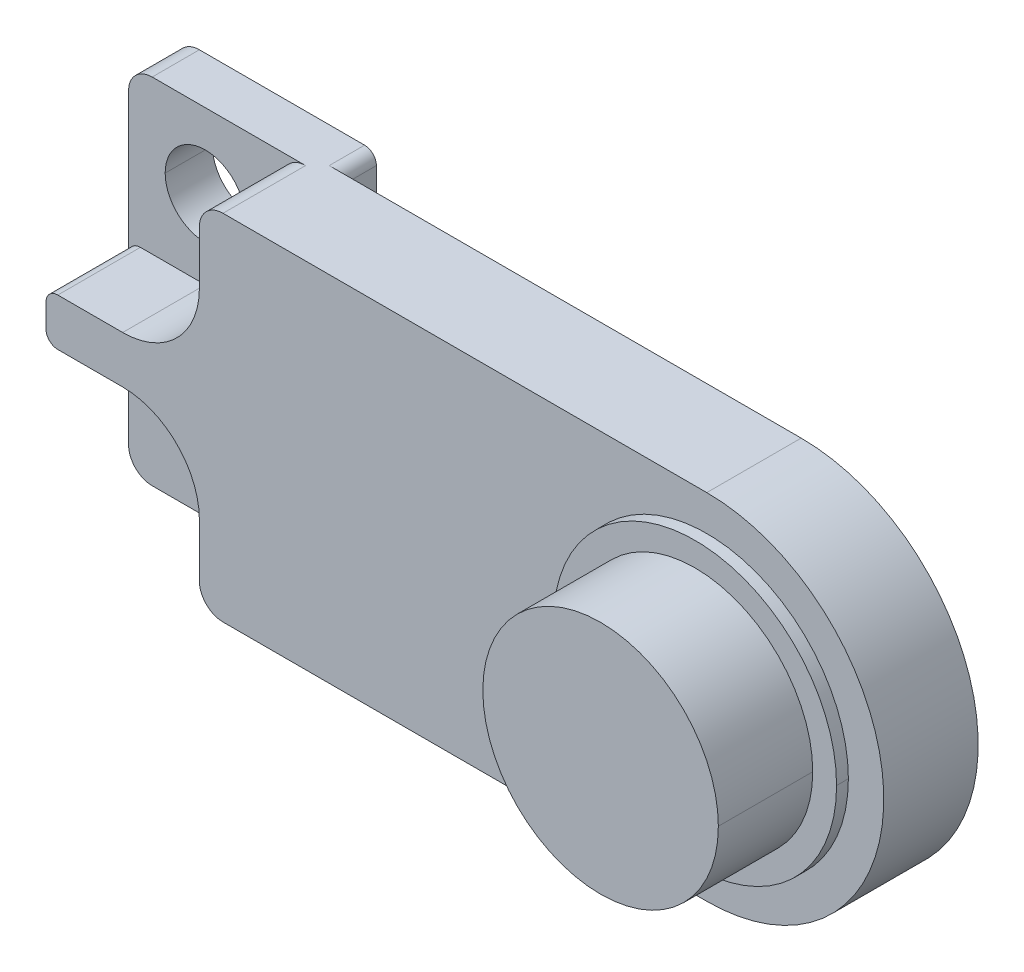
ISO-10303-21;
HEADER;
FILE_DESCRIPTION(('STEP AP214'),'2;1');
FILE_NAME('part.step','',(''),(''),'','','');
FILE_SCHEMA(('AUTOMOTIVE_DESIGN { 1 0 10303 214 1 1 1 1 }'));
ENDSEC;
DATA;
#1=APPLICATION_CONTEXT('core data for automotive mechanical design processes');
#2=APPLICATION_PROTOCOL_DEFINITION('international standard','automotive_design',2000,#1);
#3=PRODUCT_CONTEXT('',#1,'mechanical');
#4=PRODUCT('Part','Part','',(#3));
#5=PRODUCT_RELATED_PRODUCT_CATEGORY('part','',(#4));
#6=PRODUCT_DEFINITION_FORMATION('','',#4);
#7=PRODUCT_DEFINITION_CONTEXT('part definition',#1,'design');
#8=PRODUCT_DEFINITION('design','',#6,#7);
#9=PRODUCT_DEFINITION_SHAPE('','',#8);
#10=(LENGTH_UNIT() NAMED_UNIT(*) SI_UNIT(.MILLI.,.METRE.));
#11=(NAMED_UNIT(*) PLANE_ANGLE_UNIT() SI_UNIT($,.RADIAN.));
#12=(NAMED_UNIT(*) SI_UNIT($,.STERADIAN.) SOLID_ANGLE_UNIT());
#13=UNCERTAINTY_MEASURE_WITH_UNIT(LENGTH_MEASURE(1.E-05),#10,'distance_accuracy_value','');
#14=(GEOMETRIC_REPRESENTATION_CONTEXT(3) GLOBAL_UNCERTAINTY_ASSIGNED_CONTEXT((#13)) GLOBAL_UNIT_ASSIGNED_CONTEXT((#10,
#11,#12)) REPRESENTATION_CONTEXT('',''));
#15=CARTESIAN_POINT('',(0.,0.,0.));
#16=DIRECTION('',(0.,0.,1.));
#17=DIRECTION('',(1.,0.,0.));
#18=AXIS2_PLACEMENT_3D('',#15,#16,#17);
#19=CARTESIAN_POINT('',(19.5,-1.83387272193696,10.));
#20=DIRECTION('',(0.,0.,1.));
#21=DIRECTION('',(1.,0.,0.));
#22=AXIS2_PLACEMENT_3D('',#19,#20,#21);
#23=PLANE('',#22);
#24=CARTESIAN_POINT('',(19.5,-1.83387272193696,10.));
#25=DIRECTION('',(0.,0.,1.));
#26=DIRECTION('',(1.,0.,0.));
#27=AXIS2_PLACEMENT_3D('',#24,#25,#26);
#28=CIRCLE('',#27,4.99);
#29=CARTESIAN_POINT('',(24.49,-1.83387272193696,10.));
#30=VERTEX_POINT('',#29);
#31=CARTESIAN_POINT('',(14.51,-1.83387272193696,10.));
#32=VERTEX_POINT('',#31);
#33=EDGE_CURVE('E299',#30,#32,#28,.T.);
#34=ORIENTED_EDGE('',*,*,#33,.T.);
#35=CARTESIAN_POINT('',(19.5,-1.83387272193696,10.));
#36=DIRECTION('',(0.,0.,1.));
#37=DIRECTION('',(1.,0.,0.));
#38=AXIS2_PLACEMENT_3D('',#35,#36,#37);
#39=CIRCLE('',#38,4.99);
#40=EDGE_CURVE('E9',#32,#30,#39,.T.);
#41=ORIENTED_EDGE('',*,*,#40,.T.);
#42=EDGE_LOOP('',(#34,#41));
#43=FACE_BOUND('',#42,.T.);
#44=ADVANCED_FACE('F15',(#43),#23,.T.);
#45=CARTESIAN_POINT('',(19.5,-1.83387272193696,-8.14213562373094));
#46=DIRECTION('',(0.,0.,1.));
#47=DIRECTION('',(1.,0.,0.));
#48=AXIS2_PLACEMENT_3D('',#45,#46,#47);
#49=CYLINDRICAL_SURFACE('',#48,4.99);
#50=DIRECTION('',(0.,0.,1.));
#51=VECTOR('',#50,1.);
#52=CARTESIAN_POINT('',(14.51,-1.83387272193696,-8.14213562373094));
#53=LINE('',#52,#51);
#54=CARTESIAN_POINT('',(14.51,-1.83387272193696,6.));
#55=VERTEX_POINT('',#54);
#56=EDGE_CURVE('E293',#55,#32,#53,.T.);
#57=ORIENTED_EDGE('',*,*,#56,.F.);
#58=CARTESIAN_POINT('',(19.5,-1.83387272193696,6.));
#59=DIRECTION('',(0.,0.,-1.));
#60=DIRECTION('',(1.,0.,0.));
#61=AXIS2_PLACEMENT_3D('',#58,#59,#60);
#62=CIRCLE('',#61,4.99);
#63=CARTESIAN_POINT('',(24.49,-1.83387272193696,6.));
#64=VERTEX_POINT('',#63);
#65=EDGE_CURVE('E279',#64,#55,#62,.T.);
#66=ORIENTED_EDGE('',*,*,#65,.F.);
#67=DIRECTION('',(0.,0.,1.));
#68=VECTOR('',#67,1.);
#69=CARTESIAN_POINT('',(24.49,-1.83387272193696,-8.14213562373094));
#70=LINE('',#69,#68);
#71=EDGE_CURVE('E302',#64,#30,#70,.T.);
#72=ORIENTED_EDGE('',*,*,#71,.T.);
#73=ORIENTED_EDGE('',*,*,#40,.F.);
#74=EDGE_LOOP('',(#57,#66,#72,#73));
#75=FACE_BOUND('',#74,.T.);
#76=ADVANCED_FACE('F294',(#75),#49,.T.);
#77=CARTESIAN_POINT('',(-1.,-8.33387272193696,2.));
#78=DIRECTION('',(0.,0.,1.));
#79=DIRECTION('',(1.,0.,0.));
#80=AXIS2_PLACEMENT_3D('',#77,#78,#79);
#81=CYLINDRICAL_SURFACE('',#80,1.);
#82=CARTESIAN_POINT('',(-1.,-8.33387272193696,2.));
#83=DIRECTION('',(0.,0.,-1.));
#84=DIRECTION('',(1.,0.,0.));
#85=AXIS2_PLACEMENT_3D('',#82,#83,#84);
#86=CIRCLE('',#85,1.);
#87=CARTESIAN_POINT('',(-1.,-9.33387272193696,2.));
#88=VERTEX_POINT('',#87);
#89=CARTESIAN_POINT('',(-2.,-8.33387272193696,2.));
#90=VERTEX_POINT('',#89);
#91=EDGE_CURVE('E591',#88,#90,#86,.T.);
#92=ORIENTED_EDGE('',*,*,#91,.F.);
#93=DIRECTION('',(0.,0.,-1.));
#94=VECTOR('',#93,1.);
#95=CARTESIAN_POINT('',(-1.,-9.33387272193696,1.5));
#96=LINE('',#95,#94);
#97=CARTESIAN_POINT('',(-1.,-9.33387272193696,5.5));
#98=VERTEX_POINT('',#97);
#99=EDGE_CURVE('E526',#98,#88,#96,.T.);
#100=ORIENTED_EDGE('',*,*,#99,.F.);
#101=CARTESIAN_POINT('',(-1.,-8.33387272193696,5.5));
#102=DIRECTION('',(0.,0.,1.));
#103=DIRECTION('',(1.,0.,0.));
#104=AXIS2_PLACEMENT_3D('',#101,#102,#103);
#105=CIRCLE('',#104,1.);
#106=CARTESIAN_POINT('',(-2.,-8.33387272193696,5.5));
#107=VERTEX_POINT('',#106);
#108=EDGE_CURVE('E334',#107,#98,#105,.T.);
#109=ORIENTED_EDGE('',*,*,#108,.F.);
#110=DIRECTION('',(0.,0.,1.));
#111=VECTOR('',#110,1.);
#112=CARTESIAN_POINT('',(-2.,-8.33387272193696,2.));
#113=LINE('',#112,#111);
#114=EDGE_CURVE('E497',#90,#107,#113,.T.);
#115=ORIENTED_EDGE('',*,*,#114,.F.);
#116=EDGE_LOOP('',(#92,#100,#109,#115));
#117=FACE_BOUND('',#116,.T.);
#118=ADVANCED_FACE('F17',(#117),#81,.T.);
#119=CARTESIAN_POINT('',(-1.,4.66612727806304,1.5));
#120=DIRECTION('',(0.,0.,1.));
#121=DIRECTION('',(1.,0.,0.));
#122=AXIS2_PLACEMENT_3D('',#119,#120,#121);
#123=CYLINDRICAL_SURFACE('',#122,1.);
#124=CARTESIAN_POINT('',(-1.,4.66612727806304,2.));
#125=DIRECTION('',(0.,0.,-1.));
#126=DIRECTION('',(1.,0.,0.));
#127=AXIS2_PLACEMENT_3D('',#124,#125,#126);
#128=CIRCLE('',#127,1.);
#129=CARTESIAN_POINT('',(-2.,4.66612727806304,2.));
#130=VERTEX_POINT('',#129);
#131=CARTESIAN_POINT('',(-1.,5.66612727806305,2.));
#132=VERTEX_POINT('',#131);
#133=EDGE_CURVE('E24',#130,#132,#128,.T.);
#134=ORIENTED_EDGE('',*,*,#133,.F.);
#135=DIRECTION('',(0.,0.,-1.));
#136=VECTOR('',#135,1.);
#137=CARTESIAN_POINT('',(-2.,4.66612727806304,2.));
#138=LINE('',#137,#136);
#139=CARTESIAN_POINT('',(-2.,4.66612727806304,5.5));
#140=VERTEX_POINT('',#139);
#141=EDGE_CURVE('E601',#140,#130,#138,.T.);
#142=ORIENTED_EDGE('',*,*,#141,.F.);
#143=CARTESIAN_POINT('',(-1.,4.66612727806304,5.5));
#144=DIRECTION('',(0.,0.,1.));
#145=DIRECTION('',(1.,0.,0.));
#146=AXIS2_PLACEMENT_3D('',#143,#144,#145);
#147=CIRCLE('',#146,1.);
#148=CARTESIAN_POINT('',(-1.,5.66612727806304,5.5));
#149=VERTEX_POINT('',#148);
#150=EDGE_CURVE('E409',#149,#140,#147,.T.);
#151=ORIENTED_EDGE('',*,*,#150,.F.);
#152=DIRECTION('',(0.,0.,1.));
#153=VECTOR('',#152,1.);
#154=CARTESIAN_POINT('',(-1.,5.66612727806304,1.5));
#155=LINE('',#154,#153);
#156=EDGE_CURVE('E433',#132,#149,#155,.T.);
#157=ORIENTED_EDGE('',*,*,#156,.F.);
#158=EDGE_LOOP('',(#134,#142,#151,#157));
#159=FACE_BOUND('',#158,.T.);
#160=ADVANCED_FACE('F637',(#159),#123,.T.);
#161=CARTESIAN_POINT('',(-7.5,4.66612727806304,1.5));
#162=DIRECTION('',(0.,0.,-1.));
#163=DIRECTION('',(-1.,0.,0.));
#164=AXIS2_PLACEMENT_3D('',#161,#162,#163);
#165=CYLINDRICAL_SURFACE('',#164,1.);
#166=CARTESIAN_POINT('',(-7.5,4.66612727806304,2.));
#167=DIRECTION('',(0.,0.,1.));
#168=DIRECTION('',(1.,0.,0.));
#169=AXIS2_PLACEMENT_3D('',#166,#167,#168);
#170=CIRCLE('',#169,1.);
#171=CARTESIAN_POINT('',(-7.5,5.66612727806304,2.));
#172=VERTEX_POINT('',#171);
#173=CARTESIAN_POINT('',(-8.5,4.66612727806304,2.));
#174=VERTEX_POINT('',#173);
#175=EDGE_CURVE('E333',#172,#174,#170,.T.);
#176=ORIENTED_EDGE('',*,*,#175,.F.);
#177=DIRECTION('',(0.,0.,1.));
#178=VECTOR('',#177,1.);
#179=CARTESIAN_POINT('',(-7.5,5.66612727806304,1.5));
#180=LINE('',#179,#178);
#181=CARTESIAN_POINT('',(-7.5,5.66612727806304,0.));
#182=VERTEX_POINT('',#181);
#183=EDGE_CURVE('E353',#182,#172,#180,.T.);
#184=ORIENTED_EDGE('',*,*,#183,.F.);
#185=CARTESIAN_POINT('',(-7.5,4.66612727806304,0.));
#186=DIRECTION('',(0.,0.,-1.));
#187=DIRECTION('',(-1.,0.,0.));
#188=AXIS2_PLACEMENT_3D('',#185,#186,#187);
#189=CIRCLE('',#188,1.);
#190=CARTESIAN_POINT('',(-8.5,4.66612727806303,0.));
#191=VERTEX_POINT('',#190);
#192=EDGE_CURVE('E392',#191,#182,#189,.T.);
#193=ORIENTED_EDGE('',*,*,#192,.F.);
#194=DIRECTION('',(0.,0.,-1.));
#195=VECTOR('',#194,1.);
#196=CARTESIAN_POINT('',(-8.5,4.66612727806304,1.5));
#197=LINE('',#196,#195);
#198=EDGE_CURVE('E480',#174,#191,#197,.T.);
#199=ORIENTED_EDGE('',*,*,#198,.F.);
#200=EDGE_LOOP('',(#176,#184,#193,#199));
#201=FACE_BOUND('',#200,.T.);
#202=ADVANCED_FACE('F615',(#201),#165,.T.);
#203=CARTESIAN_POINT('',(-7.5,-8.33387272193696,1.5));
#204=DIRECTION('',(0.,0.,-1.));
#205=DIRECTION('',(-1.,0.,0.));
#206=AXIS2_PLACEMENT_3D('',#203,#204,#205);
#207=CYLINDRICAL_SURFACE('',#206,1.);
#208=CARTESIAN_POINT('',(-7.5,-8.33387272193696,2.));
#209=DIRECTION('',(0.,0.,1.));
#210=DIRECTION('',(1.,0.,0.));
#211=AXIS2_PLACEMENT_3D('',#208,#209,#210);
#212=CIRCLE('',#211,1.);
#213=CARTESIAN_POINT('',(-8.5,-8.33387272193696,2.));
#214=VERTEX_POINT('',#213);
#215=CARTESIAN_POINT('',(-7.5,-9.33387272193696,2.));
#216=VERTEX_POINT('',#215);
#217=EDGE_CURVE('E554',#214,#216,#212,.T.);
#218=ORIENTED_EDGE('',*,*,#217,.F.);
#219=DIRECTION('',(0.,0.,1.));
#220=VECTOR('',#219,1.);
#221=CARTESIAN_POINT('',(-8.5,-8.33387272193696,1.5));
#222=LINE('',#221,#220);
#223=CARTESIAN_POINT('',(-8.5,-8.33387272193696,0.));
#224=VERTEX_POINT('',#223);
#225=EDGE_CURVE('E366',#224,#214,#222,.T.);
#226=ORIENTED_EDGE('',*,*,#225,.F.);
#227=CARTESIAN_POINT('',(-7.5,-8.33387272193696,0.));
#228=DIRECTION('',(0.,0.,-1.));
#229=DIRECTION('',(-1.,0.,0.));
#230=AXIS2_PLACEMENT_3D('',#227,#228,#229);
#231=CIRCLE('',#230,1.);
#232=CARTESIAN_POINT('',(-7.5,-9.33387272193696,0.));
#233=VERTEX_POINT('',#232);
#234=EDGE_CURVE('E448',#233,#224,#231,.T.);
#235=ORIENTED_EDGE('',*,*,#234,.F.);
#236=DIRECTION('',(0.,0.,-1.));
#237=VECTOR('',#236,1.);
#238=CARTESIAN_POINT('',(-7.5,-9.33387272193696,1.5));
#239=LINE('',#238,#237);
#240=EDGE_CURVE('E479',#216,#233,#239,.T.);
#241=ORIENTED_EDGE('',*,*,#240,.F.);
#242=EDGE_LOOP('',(#218,#226,#235,#241));
#243=FACE_BOUND('',#242,.T.);
#244=ADVANCED_FACE('F653',(#243),#207,.T.);
#245=CARTESIAN_POINT('',(-0.5,-8.83387272193696,1.5));
#246=DIRECTION('',(0.,0.,-1.));
#247=DIRECTION('',(-1.,0.,0.));
#248=AXIS2_PLACEMENT_3D('',#245,#246,#247);
#249=CYLINDRICAL_SURFACE('',#248,0.5);
#250=CARTESIAN_POINT('',(-0.5,-8.83387272193696,1.5));
#251=DIRECTION('',(0.,0.,1.));
#252=DIRECTION('',(1.,0.,0.));
#253=AXIS2_PLACEMENT_3D('',#250,#251,#252);
#254=CIRCLE('',#253,0.5);
#255=CARTESIAN_POINT('',(-0.5,-9.33387272193696,1.5));
#256=VERTEX_POINT('',#255);
#257=CARTESIAN_POINT('',(0.,-8.83387272193696,1.5));
#258=VERTEX_POINT('',#257);
#259=EDGE_CURVE('E312',#256,#258,#254,.T.);
#260=ORIENTED_EDGE('',*,*,#259,.F.);
#261=DIRECTION('',(0.,0.,1.));
#262=VECTOR('',#261,1.);
#263=CARTESIAN_POINT('',(-0.5,-9.33387272193696,1.5));
#264=LINE('',#263,#262);
#265=CARTESIAN_POINT('',(-0.5,-9.33387272193696,0.));
#266=VERTEX_POINT('',#265);
#267=EDGE_CURVE('E511',#266,#256,#264,.T.);
#268=ORIENTED_EDGE('',*,*,#267,.F.);
#269=CARTESIAN_POINT('',(-0.5,-8.83387272193696,0.));
#270=DIRECTION('',(0.,0.,-1.));
#271=DIRECTION('',(-1.,0.,0.));
#272=AXIS2_PLACEMENT_3D('',#269,#270,#271);
#273=CIRCLE('',#272,0.5);
#274=CARTESIAN_POINT('',(0.,-8.83387272193696,0.));
#275=VERTEX_POINT('',#274);
#276=EDGE_CURVE('E362',#275,#266,#273,.T.);
#277=ORIENTED_EDGE('',*,*,#276,.F.);
#278=DIRECTION('',(0.,0.,-1.));
#279=VECTOR('',#278,1.);
#280=CARTESIAN_POINT('',(0.,-8.83387272193696,1.5));
#281=LINE('',#280,#279);
#282=EDGE_CURVE('E358',#258,#275,#281,.T.);
#283=ORIENTED_EDGE('',*,*,#282,.F.);
#284=EDGE_LOOP('',(#260,#268,#277,#283));
#285=FACE_BOUND('',#284,.T.);
#286=ADVANCED_FACE('F697',(#285),#249,.T.);
#287=CARTESIAN_POINT('',(-0.5,5.16612727806304,1.5));
#288=DIRECTION('',(0.,0.,-1.));
#289=DIRECTION('',(-1.,0.,0.));
#290=AXIS2_PLACEMENT_3D('',#287,#288,#289);
#291=CYLINDRICAL_SURFACE('',#290,0.5);
#292=CARTESIAN_POINT('',(-0.5,5.16612727806304,1.5));
#293=DIRECTION('',(0.,0.,1.));
#294=DIRECTION('',(1.,0.,0.));
#295=AXIS2_PLACEMENT_3D('',#292,#293,#294);
#296=CIRCLE('',#295,0.5);
#297=CARTESIAN_POINT('',(0.,5.16612727806304,1.5));
#298=VERTEX_POINT('',#297);
#299=CARTESIAN_POINT('',(-0.5,5.66612727806304,1.5));
#300=VERTEX_POINT('',#299);
#301=EDGE_CURVE('E315',#298,#300,#296,.T.);
#302=ORIENTED_EDGE('',*,*,#301,.F.);
#303=DIRECTION('',(0.,0.,1.));
#304=VECTOR('',#303,1.);
#305=CARTESIAN_POINT('',(0.,5.16612727806304,1.5));
#306=LINE('',#305,#304);
#307=CARTESIAN_POINT('',(0.,5.16612727806304,0.));
#308=VERTEX_POINT('',#307);
#309=EDGE_CURVE('E530',#308,#298,#306,.T.);
#310=ORIENTED_EDGE('',*,*,#309,.F.);
#311=CARTESIAN_POINT('',(-0.5,5.16612727806304,0.));
#312=DIRECTION('',(0.,0.,-1.));
#313=DIRECTION('',(-1.,0.,0.));
#314=AXIS2_PLACEMENT_3D('',#311,#312,#313);
#315=CIRCLE('',#314,0.5);
#316=CARTESIAN_POINT('',(-0.5,5.66612727806304,0.));
#317=VERTEX_POINT('',#316);
#318=EDGE_CURVE('E381',#317,#308,#315,.T.);
#319=ORIENTED_EDGE('',*,*,#318,.F.);
#320=DIRECTION('',(0.,0.,-1.));
#321=VECTOR('',#320,1.);
#322=CARTESIAN_POINT('',(-0.5,5.66612727806304,1.5));
#323=LINE('',#322,#321);
#324=EDGE_CURVE('E316',#300,#317,#323,.T.);
#325=ORIENTED_EDGE('',*,*,#324,.F.);
#326=EDGE_LOOP('',(#302,#310,#319,#325));
#327=FACE_BOUND('',#326,.T.);
#328=ADVANCED_FACE('F690',(#327),#291,.T.);
#329=CARTESIAN_POINT('',(-8.,-1.33387272193696,2.));
#330=DIRECTION('',(0.,0.,1.));
#331=DIRECTION('',(1.,0.,0.));
#332=AXIS2_PLACEMENT_3D('',#329,#330,#331);
#333=CYLINDRICAL_SURFACE('',#332,0.5);
#334=CARTESIAN_POINT('',(-8.,-1.33387272193696,2.));
#335=DIRECTION('',(0.,0.,-1.));
#336=DIRECTION('',(1.,0.,0.));
#337=AXIS2_PLACEMENT_3D('',#334,#335,#336);
#338=CIRCLE('',#337,0.5);
#339=CARTESIAN_POINT('',(-8.5,-1.33387272193696,2.));
#340=VERTEX_POINT('',#339);
#341=CARTESIAN_POINT('',(-8.,-0.833872721936961,2.));
#342=VERTEX_POINT('',#341);
#343=EDGE_CURVE('E47',#340,#342,#338,.T.);
#344=ORIENTED_EDGE('',*,*,#343,.F.);
#345=DIRECTION('',(0.,0.,-1.));
#346=VECTOR('',#345,1.);
#347=CARTESIAN_POINT('',(-8.5,-1.33387272193696,1.5));
#348=LINE('',#347,#346);
#349=CARTESIAN_POINT('',(-8.5,-1.33387272193696,5.5));
#350=VERTEX_POINT('',#349);
#351=EDGE_CURVE('E492',#350,#340,#348,.T.);
#352=ORIENTED_EDGE('',*,*,#351,.F.);
#353=CARTESIAN_POINT('',(-8.,-1.33387272193696,5.5));
#354=DIRECTION('',(0.,0.,1.));
#355=DIRECTION('',(1.,0.,0.));
#356=AXIS2_PLACEMENT_3D('',#353,#354,#355);
#357=CIRCLE('',#356,0.5);
#358=CARTESIAN_POINT('',(-8.,-0.833872721936961,5.5));
#359=VERTEX_POINT('',#358);
#360=EDGE_CURVE('E565',#359,#350,#357,.T.);
#361=ORIENTED_EDGE('',*,*,#360,.F.);
#362=DIRECTION('',(0.,0.,1.));
#363=VECTOR('',#362,1.);
#364=CARTESIAN_POINT('',(-8.,-0.833872721936961,2.));
#365=LINE('',#364,#363);
#366=EDGE_CURVE('E380',#342,#359,#365,.T.);
#367=ORIENTED_EDGE('',*,*,#366,.F.);
#368=EDGE_LOOP('',(#344,#352,#361,#367));
#369=FACE_BOUND('',#368,.T.);
#370=ADVANCED_FACE('F623',(#369),#333,.T.);
#371=CARTESIAN_POINT('',(-8.,-2.33387272193696,1.5));
#372=DIRECTION('',(0.,0.,1.));
#373=DIRECTION('',(1.,0.,0.));
#374=AXIS2_PLACEMENT_3D('',#371,#372,#373);
#375=CYLINDRICAL_SURFACE('',#374,0.5);
#376=CARTESIAN_POINT('',(-8.,-2.33387272193696,2.));
#377=DIRECTION('',(0.,0.,-1.));
#378=DIRECTION('',(1.,0.,0.));
#379=AXIS2_PLACEMENT_3D('',#376,#377,#378);
#380=CIRCLE('',#379,0.5);
#381=CARTESIAN_POINT('',(-8.,-2.83387272193696,2.));
#382=VERTEX_POINT('',#381);
#383=CARTESIAN_POINT('',(-8.5,-2.33387272193696,2.));
#384=VERTEX_POINT('',#383);
#385=EDGE_CURVE('E508',#382,#384,#380,.T.);
#386=ORIENTED_EDGE('',*,*,#385,.F.);
#387=DIRECTION('',(0.,0.,-1.));
#388=VECTOR('',#387,1.);
#389=CARTESIAN_POINT('',(-8.,-2.83387272193696,2.));
#390=LINE('',#389,#388);
#391=CARTESIAN_POINT('',(-8.,-2.83387272193696,5.5));
#392=VERTEX_POINT('',#391);
#393=EDGE_CURVE('E500',#392,#382,#390,.T.);
#394=ORIENTED_EDGE('',*,*,#393,.F.);
#395=CARTESIAN_POINT('',(-8.,-2.33387272193696,5.5));
#396=DIRECTION('',(0.,0.,1.));
#397=DIRECTION('',(1.,0.,0.));
#398=AXIS2_PLACEMENT_3D('',#395,#396,#397);
#399=CIRCLE('',#398,0.5);
#400=CARTESIAN_POINT('',(-8.5,-2.33387272193696,5.5));
#401=VERTEX_POINT('',#400);
#402=EDGE_CURVE('E568',#401,#392,#399,.T.);
#403=ORIENTED_EDGE('',*,*,#402,.F.);
#404=DIRECTION('',(0.,0.,1.));
#405=VECTOR('',#404,1.);
#406=CARTESIAN_POINT('',(-8.5,-2.33387272193696,1.5));
#407=LINE('',#406,#405);
#408=EDGE_CURVE('E453',#384,#401,#407,.T.);
#409=ORIENTED_EDGE('',*,*,#408,.F.);
#410=EDGE_LOOP('',(#386,#394,#403,#409));
#411=FACE_BOUND('',#410,.T.);
#412=ADVANCED_FACE('F660',(#411),#375,.T.);
#413=CARTESIAN_POINT('',(-5.25,2.41612727806304,2.));
#414=DIRECTION('',(0.,0.,1.));
#415=DIRECTION('',(1.,0.,0.));
#416=AXIS2_PLACEMENT_3D('',#413,#414,#415);
#417=PLANE('',#416);
#418=CARTESIAN_POINT('',(-5.25,2.41612727806304,2.));
#419=DIRECTION('',(0.,0.,1.));
#420=DIRECTION('',(1.,0.,0.));
#421=AXIS2_PLACEMENT_3D('',#418,#419,#420);
#422=CIRCLE('',#421,1.7);
#423=CARTESIAN_POINT('',(-6.95,2.41612727806304,2.));
#424=VERTEX_POINT('',#423);
#425=CARTESIAN_POINT('',(-3.55,2.41612727806304,2.));
#426=VERTEX_POINT('',#425);
#427=EDGE_CURVE('E373',#424,#426,#422,.T.);
#428=ORIENTED_EDGE('',*,*,#427,.F.);
#429=CARTESIAN_POINT('',(-5.25,2.41612727806304,2.));
#430=DIRECTION('',(0.,0.,1.));
#431=DIRECTION('',(1.,0.,0.));
#432=AXIS2_PLACEMENT_3D('',#429,#430,#431);
#433=CIRCLE('',#432,1.7);
#434=EDGE_CURVE('E417',#426,#424,#433,.T.);
#435=ORIENTED_EDGE('',*,*,#434,.F.);
#436=EDGE_LOOP('',(#428,#435));
#437=FACE_BOUND('',#436,.T.);
#438=DIRECTION('',(-1.,0.,0.));
#439=VECTOR('',#438,1.);
#440=CARTESIAN_POINT('',(-8.5,5.66612727806304,2.));
#441=LINE('',#440,#439);
#442=EDGE_CURVE('E357',#132,#172,#441,.T.);
#443=ORIENTED_EDGE('',*,*,#442,.T.);
#444=ORIENTED_EDGE('',*,*,#175,.T.);
#445=DIRECTION('',(0.,-1.,0.));
#446=VECTOR('',#445,1.);
#447=CARTESIAN_POINT('',(-8.5,-0.833872721936962,2.));
#448=LINE('',#447,#446);
#449=EDGE_CURVE('E496',#174,#340,#448,.T.);
#450=ORIENTED_EDGE('',*,*,#449,.T.);
#451=ORIENTED_EDGE('',*,*,#343,.T.);
#452=DIRECTION('',(1.,0.,0.));
#453=VECTOR('',#452,1.);
#454=CARTESIAN_POINT('',(-5.25,-0.833872721936956,2.));
#455=LINE('',#454,#453);
#456=CARTESIAN_POINT('',(-5.25,-0.833872721936956,2.));
#457=VERTEX_POINT('',#456);
#458=EDGE_CURVE('E351',#342,#457,#455,.T.);
#459=ORIENTED_EDGE('',*,*,#458,.T.);
#460=CARTESIAN_POINT('',(-5.25,2.41612727806304,2.));
#461=DIRECTION('',(0.,0.,1.));
#462=DIRECTION('',(1.,0.,0.));
#463=AXIS2_PLACEMENT_3D('',#460,#461,#462);
#464=CIRCLE('',#463,3.25);
#465=CARTESIAN_POINT('',(-2.,2.41612727806304,2.));
#466=VERTEX_POINT('',#465);
#467=EDGE_CURVE('E352',#457,#466,#464,.T.);
#468=ORIENTED_EDGE('',*,*,#467,.T.);
#469=DIRECTION('',(0.,1.,0.));
#470=VECTOR('',#469,1.);
#471=CARTESIAN_POINT('',(-2.,5.66612727806305,2.));
#472=LINE('',#471,#470);
#473=EDGE_CURVE('E605',#466,#130,#472,.T.);
#474=ORIENTED_EDGE('',*,*,#473,.T.);
#475=ORIENTED_EDGE('',*,*,#133,.T.);
#476=EDGE_LOOP('',(#443,#444,#450,#451,#459,#468,#474,#475));
#477=FACE_BOUND('',#476,.T.);
#478=ADVANCED_FACE('F610',(#437,#477),#417,.T.);
#479=CARTESIAN_POINT('',(-2.,5.66612727806305,2.));
#480=DIRECTION('',(1.,0.,0.));
#481=DIRECTION('',(0.,1.,0.));
#482=AXIS2_PLACEMENT_3D('',#479,#480,#481);
#483=PLANE('',#482);
#484=DIRECTION('',(0.,1.,0.));
#485=VECTOR('',#484,1.);
#486=CARTESIAN_POINT('',(-2.,5.66612727806305,5.5));
#487=LINE('',#486,#485);
#488=CARTESIAN_POINT('',(-2.,2.41612727806304,5.5));
#489=VERTEX_POINT('',#488);
#490=EDGE_CURVE('E518',#489,#140,#487,.T.);
#491=ORIENTED_EDGE('',*,*,#490,.T.);
#492=ORIENTED_EDGE('',*,*,#141,.T.);
#493=ORIENTED_EDGE('',*,*,#473,.F.);
#494=DIRECTION('',(0.,0.,1.));
#495=VECTOR('',#494,1.);
#496=CARTESIAN_POINT('',(-2.,2.41612727806304,2.));
#497=LINE('',#496,#495);
#498=EDGE_CURVE('E505',#466,#489,#497,.T.);
#499=ORIENTED_EDGE('',*,*,#498,.T.);
#500=EDGE_LOOP('',(#491,#492,#493,#499));
#501=FACE_BOUND('',#500,.T.);
#502=ADVANCED_FACE('F636',(#501),#483,.F.);
#503=CARTESIAN_POINT('',(-5.25,-0.833872721936956,2.));
#504=DIRECTION('',(0.,-1.,0.));
#505=DIRECTION('',(0.,0.,-1.));
#506=AXIS2_PLACEMENT_3D('',#503,#504,#505);
#507=PLANE('',#506);
#508=ORIENTED_EDGE('',*,*,#458,.F.);
#509=ORIENTED_EDGE('',*,*,#366,.T.);
#510=DIRECTION('',(1.,0.,0.));
#511=VECTOR('',#510,1.);
#512=CARTESIAN_POINT('',(-5.25,-0.833872721936956,5.5));
#513=LINE('',#512,#511);
#514=CARTESIAN_POINT('',(-5.25,-0.833872721936956,5.5));
#515=VERTEX_POINT('',#514);
#516=EDGE_CURVE('E561',#359,#515,#513,.T.);
#517=ORIENTED_EDGE('',*,*,#516,.T.);
#518=DIRECTION('',(0.,0.,1.));
#519=VECTOR('',#518,1.);
#520=CARTESIAN_POINT('',(-5.25,-0.833872721936956,2.));
#521=LINE('',#520,#519);
#522=EDGE_CURVE('E348',#457,#515,#521,.T.);
#523=ORIENTED_EDGE('',*,*,#522,.F.);
#524=EDGE_LOOP('',(#508,#509,#517,#523));
#525=FACE_BOUND('',#524,.T.);
#526=ADVANCED_FACE('F628',(#525),#507,.F.);
#527=CARTESIAN_POINT('',(-5.25,2.41612727806304,2.));
#528=DIRECTION('',(0.,0.,1.));
#529=DIRECTION('',(1.,0.,0.));
#530=AXIS2_PLACEMENT_3D('',#527,#528,#529);
#531=CYLINDRICAL_SURFACE('',#530,3.25);
#532=CARTESIAN_POINT('',(-5.25,2.41612727806304,5.5));
#533=DIRECTION('',(0.,0.,1.));
#534=DIRECTION('',(1.,0.,0.));
#535=AXIS2_PLACEMENT_3D('',#532,#533,#534);
#536=CIRCLE('',#535,3.25);
#537=EDGE_CURVE('E522',#515,#489,#536,.T.);
#538=ORIENTED_EDGE('',*,*,#537,.T.);
#539=ORIENTED_EDGE('',*,*,#498,.F.);
#540=ORIENTED_EDGE('',*,*,#467,.F.);
#541=ORIENTED_EDGE('',*,*,#522,.T.);
#542=EDGE_LOOP('',(#538,#539,#540,#541));
#543=FACE_BOUND('',#542,.T.);
#544=ADVANCED_FACE('F632',(#543),#531,.F.);
#545=CARTESIAN_POINT('',(-5.25,-6.08387272193696,2.));
#546=DIRECTION('',(0.,0.,1.));
#547=DIRECTION('',(1.,0.,0.));
#548=AXIS2_PLACEMENT_3D('',#545,#546,#547);
#549=PLANE('',#548);
#550=CARTESIAN_POINT('',(-5.25,-6.08387272193696,2.));
#551=DIRECTION('',(0.,0.,1.));
#552=DIRECTION('',(1.,0.,0.));
#553=AXIS2_PLACEMENT_3D('',#550,#551,#552);
#554=CIRCLE('',#553,1.7);
#555=CARTESIAN_POINT('',(-6.95,-6.08387272193696,2.));
#556=VERTEX_POINT('',#555);
#557=CARTESIAN_POINT('',(-3.55,-6.08387272193696,2.));
#558=VERTEX_POINT('',#557);
#559=EDGE_CURVE('E377',#556,#558,#554,.T.);
#560=ORIENTED_EDGE('',*,*,#559,.F.);
#561=CARTESIAN_POINT('',(-5.25,-6.08387272193696,2.));
#562=DIRECTION('',(0.,0.,1.));
#563=DIRECTION('',(1.,0.,0.));
#564=AXIS2_PLACEMENT_3D('',#561,#562,#563);
#565=CIRCLE('',#564,1.7);
#566=EDGE_CURVE('E429',#558,#556,#565,.T.);
#567=ORIENTED_EDGE('',*,*,#566,.F.);
#568=EDGE_LOOP('',(#560,#567));
#569=FACE_BOUND('',#568,.T.);
#570=DIRECTION('',(0.,-1.,0.));
#571=VECTOR('',#570,1.);
#572=CARTESIAN_POINT('',(-8.5,-9.33387272193696,2.));
#573=LINE('',#572,#571);
#574=EDGE_CURVE('E449',#384,#214,#573,.T.);
#575=ORIENTED_EDGE('',*,*,#574,.T.);
#576=ORIENTED_EDGE('',*,*,#217,.T.);
#577=DIRECTION('',(1.,0.,0.));
#578=VECTOR('',#577,1.);
#579=CARTESIAN_POINT('',(-2.,-9.33387272193696,2.));
#580=LINE('',#579,#578);
#581=EDGE_CURVE('E475',#216,#88,#580,.T.);
#582=ORIENTED_EDGE('',*,*,#581,.T.);
#583=ORIENTED_EDGE('',*,*,#91,.T.);
#584=DIRECTION('',(0.,1.,0.));
#585=VECTOR('',#584,1.);
#586=CARTESIAN_POINT('',(-2.,-6.08387272193696,2.));
#587=LINE('',#586,#585);
#588=CARTESIAN_POINT('',(-2.,-6.08387272193696,2.));
#589=VERTEX_POINT('',#588);
#590=EDGE_CURVE('E443',#90,#589,#587,.T.);
#591=ORIENTED_EDGE('',*,*,#590,.T.);
#592=CARTESIAN_POINT('',(-5.25,-6.08387272193696,2.));
#593=DIRECTION('',(0.,0.,1.));
#594=DIRECTION('',(1.,0.,0.));
#595=AXIS2_PLACEMENT_3D('',#592,#593,#594);
#596=CIRCLE('',#595,3.25);
#597=CARTESIAN_POINT('',(-5.25,-2.83387272193696,2.));
#598=VERTEX_POINT('',#597);
#599=EDGE_CURVE('E444',#589,#598,#596,.T.);
#600=ORIENTED_EDGE('',*,*,#599,.T.);
#601=DIRECTION('',(-1.,0.,0.));
#602=VECTOR('',#601,1.);
#603=CARTESIAN_POINT('',(-8.5,-2.83387272193696,2.));
#604=LINE('',#603,#602);
#605=EDGE_CURVE('E550',#598,#382,#604,.T.);
#606=ORIENTED_EDGE('',*,*,#605,.T.);
#607=ORIENTED_EDGE('',*,*,#385,.T.);
#608=EDGE_LOOP('',(#575,#576,#582,#583,#591,#600,#606,#607));
#609=FACE_BOUND('',#608,.T.);
#610=ADVANCED_FACE('F657',(#569,#609),#549,.T.);
#611=CARTESIAN_POINT('',(-8.5,-2.83387272193696,2.));
#612=DIRECTION('',(0.,1.,0.));
#613=DIRECTION('',(1.,0.,0.));
#614=AXIS2_PLACEMENT_3D('',#611,#612,#613);
#615=PLANE('',#614);
#616=DIRECTION('',(-1.,0.,0.));
#617=VECTOR('',#616,1.);
#618=CARTESIAN_POINT('',(-8.5,-2.83387272193696,5.5));
#619=LINE('',#618,#617);
#620=CARTESIAN_POINT('',(-5.25,-2.83387272193696,5.5));
#621=VERTEX_POINT('',#620);
#622=EDGE_CURVE('E546',#621,#392,#619,.T.);
#623=ORIENTED_EDGE('',*,*,#622,.T.);
#624=ORIENTED_EDGE('',*,*,#393,.T.);
#625=ORIENTED_EDGE('',*,*,#605,.F.);
#626=DIRECTION('',(0.,0.,1.));
#627=VECTOR('',#626,1.);
#628=CARTESIAN_POINT('',(-5.25,-2.83387272193696,2.));
#629=LINE('',#628,#627);
#630=EDGE_CURVE('E289',#598,#621,#629,.T.);
#631=ORIENTED_EDGE('',*,*,#630,.T.);
#632=EDGE_LOOP('',(#623,#624,#625,#631));
#633=FACE_BOUND('',#632,.T.);
#634=ADVANCED_FACE('F665',(#633),#615,.F.);
#635=CARTESIAN_POINT('',(-2.,-6.08387272193696,2.));
#636=DIRECTION('',(1.,0.,0.));
#637=DIRECTION('',(0.,1.,0.));
#638=AXIS2_PLACEMENT_3D('',#635,#636,#637);
#639=PLANE('',#638);
#640=ORIENTED_EDGE('',*,*,#590,.F.);
#641=ORIENTED_EDGE('',*,*,#114,.T.);
#642=DIRECTION('',(0.,1.,0.));
#643=VECTOR('',#642,1.);
#644=CARTESIAN_POINT('',(-2.,-6.08387272193696,5.5));
#645=LINE('',#644,#643);
#646=CARTESIAN_POINT('',(-2.,-6.08387272193696,5.5));
#647=VERTEX_POINT('',#646);
#648=EDGE_CURVE('E338',#107,#647,#645,.T.);
#649=ORIENTED_EDGE('',*,*,#648,.T.);
#650=DIRECTION('',(0.,0.,1.));
#651=VECTOR('',#650,1.);
#652=CARTESIAN_POINT('',(-2.,-6.08387272193696,2.));
#653=LINE('',#652,#651);
#654=EDGE_CURVE('E440',#589,#647,#653,.T.);
#655=ORIENTED_EDGE('',*,*,#654,.F.);
#656=EDGE_LOOP('',(#640,#641,#649,#655));
#657=FACE_BOUND('',#656,.T.);
#658=ADVANCED_FACE('F673',(#657),#639,.F.);
#659=CARTESIAN_POINT('',(-5.25,-6.08387272193696,2.));
#660=DIRECTION('',(0.,0.,1.));
#661=DIRECTION('',(1.,0.,0.));
#662=AXIS2_PLACEMENT_3D('',#659,#660,#661);
#663=CYLINDRICAL_SURFACE('',#662,3.25);
#664=CARTESIAN_POINT('',(-5.25,-6.08387272193696,5.5));
#665=DIRECTION('',(0.,0.,1.));
#666=DIRECTION('',(1.,0.,0.));
#667=AXIS2_PLACEMENT_3D('',#664,#665,#666);
#668=CIRCLE('',#667,3.25);
#669=EDGE_CURVE('E488',#647,#621,#668,.T.);
#670=ORIENTED_EDGE('',*,*,#669,.T.);
#671=ORIENTED_EDGE('',*,*,#630,.F.);
#672=ORIENTED_EDGE('',*,*,#599,.F.);
#673=ORIENTED_EDGE('',*,*,#654,.T.);
#674=EDGE_LOOP('',(#670,#671,#672,#673));
#675=FACE_BOUND('',#674,.T.);
#676=ADVANCED_FACE('F669',(#675),#663,.F.);
#677=CARTESIAN_POINT('',(19.5,-1.83387272193696,6.));
#678=DIRECTION('',(0.,0.,1.));
#679=DIRECTION('',(1.,0.,0.));
#680=AXIS2_PLACEMENT_3D('',#677,#678,#679);
#681=PLANE('',#680);
#682=ORIENTED_EDGE('',*,*,#65,.T.);
#683=CARTESIAN_POINT('',(19.5,-1.83387272193696,6.));
#684=DIRECTION('',(0.,0.,-1.));
#685=DIRECTION('',(1.,0.,0.));
#686=AXIS2_PLACEMENT_3D('',#683,#684,#685);
#687=CIRCLE('',#686,4.99);
#688=EDGE_CURVE('E284',#55,#64,#687,.T.);
#689=ORIENTED_EDGE('',*,*,#688,.T.);
#690=EDGE_LOOP('',(#682,#689));
#691=FACE_BOUND('',#690,.T.);
#692=CARTESIAN_POINT('',(19.5,-1.83387272193696,6.));
#693=DIRECTION('',(0.,0.,1.));
#694=DIRECTION('',(1.,0.,0.));
#695=AXIS2_PLACEMENT_3D('',#692,#693,#694);
#696=CIRCLE('',#695,6.);
#697=CARTESIAN_POINT('',(13.5,-1.83387272193696,6.));
#698=VERTEX_POINT('',#697);
#699=CARTESIAN_POINT('',(25.5,-1.83387272193696,6.));
#700=VERTEX_POINT('',#699);
#701=EDGE_CURVE('E290',#698,#700,#696,.T.);
#702=ORIENTED_EDGE('',*,*,#701,.T.);
#703=CARTESIAN_POINT('',(19.5,-1.83387272193696,6.));
#704=DIRECTION('',(0.,0.,1.));
#705=DIRECTION('',(1.,0.,0.));
#706=AXIS2_PLACEMENT_3D('',#703,#704,#705);
#707=CIRCLE('',#706,6.);
#708=EDGE_CURVE('E341',#700,#698,#707,.T.);
#709=ORIENTED_EDGE('',*,*,#708,.T.);
#710=EDGE_LOOP('',(#702,#709));
#711=FACE_BOUND('',#710,.T.);
#712=ADVANCED_FACE('F281',(#691,#711),#681,.T.);
#713=CARTESIAN_POINT('',(19.5,-1.83387272193696,6.));
#714=DIRECTION('',(0.,0.,-1.));
#715=DIRECTION('',(-1.,0.,0.));
#716=AXIS2_PLACEMENT_3D('',#713,#714,#715);
#717=CYLINDRICAL_SURFACE('',#716,6.);
#718=DIRECTION('',(0.,0.,-1.));
#719=VECTOR('',#718,1.);
#720=CARTESIAN_POINT('',(25.5,-1.83387272193696,6.));
#721=LINE('',#720,#719);
#722=CARTESIAN_POINT('',(25.5,-1.83387272193696,5.5));
#723=VERTEX_POINT('',#722);
#724=EDGE_CURVE('E330',#700,#723,#721,.T.);
#725=ORIENTED_EDGE('',*,*,#724,.F.);
#726=ORIENTED_EDGE('',*,*,#701,.F.);
#727=DIRECTION('',(0.,0.,-1.));
#728=VECTOR('',#727,1.);
#729=CARTESIAN_POINT('',(13.5,-1.83387272193696,6.));
#730=LINE('',#729,#728);
#731=CARTESIAN_POINT('',(13.5,-1.83387272193696,5.5));
#732=VERTEX_POINT('',#731);
#733=EDGE_CURVE('E329',#698,#732,#730,.T.);
#734=ORIENTED_EDGE('',*,*,#733,.T.);
#735=CARTESIAN_POINT('',(19.5,-1.83387272193696,5.5));
#736=DIRECTION('',(0.,0.,1.));
#737=DIRECTION('',(1.,0.,0.));
#738=AXIS2_PLACEMENT_3D('',#735,#736,#737);
#739=CIRCLE('',#738,6.);
#740=EDGE_CURVE('E459',#732,#723,#739,.T.);
#741=ORIENTED_EDGE('',*,*,#740,.T.);
#742=EDGE_LOOP('',(#725,#726,#734,#741));
#743=FACE_BOUND('',#742,.T.);
#744=ADVANCED_FACE('F760',(#743),#717,.T.);
#745=CARTESIAN_POINT('',(19.5,-1.83387272193696,5.5));
#746=DIRECTION('',(0.,0.,-1.));
#747=DIRECTION('',(-1.,0.,0.));
#748=AXIS2_PLACEMENT_3D('',#745,#746,#747);
#749=CYLINDRICAL_SURFACE('',#748,7.5);
#750=CARTESIAN_POINT('',(19.5,-1.83387272193696,1.5));
#751=DIRECTION('',(0.,0.,1.));
#752=DIRECTION('',(1.,0.,0.));
#753=AXIS2_PLACEMENT_3D('',#750,#751,#752);
#754=CIRCLE('',#753,7.5);
#755=CARTESIAN_POINT('',(19.5,-9.33387272193696,1.5));
#756=VERTEX_POINT('',#755);
#757=CARTESIAN_POINT('',(19.5,5.66612727806305,1.5));
#758=VERTEX_POINT('',#757);
#759=EDGE_CURVE('E344',#756,#758,#754,.T.);
#760=ORIENTED_EDGE('',*,*,#759,.T.);
#761=DIRECTION('',(0.,0.,-1.));
#762=VECTOR('',#761,1.);
#763=CARTESIAN_POINT('',(19.5,5.66612727806305,5.5));
#764=LINE('',#763,#762);
#765=CARTESIAN_POINT('',(19.5,5.66612727806305,5.5));
#766=VERTEX_POINT('',#765);
#767=EDGE_CURVE('E319',#766,#758,#764,.T.);
#768=ORIENTED_EDGE('',*,*,#767,.F.);
#769=CARTESIAN_POINT('',(19.5,-1.83387272193696,5.5));
#770=DIRECTION('',(0.,0.,1.));
#771=DIRECTION('',(1.,0.,0.));
#772=AXIS2_PLACEMENT_3D('',#769,#770,#771);
#773=CIRCLE('',#772,7.5);
#774=CARTESIAN_POINT('',(19.5,-9.33387272193696,5.5));
#775=VERTEX_POINT('',#774);
#776=EDGE_CURVE('E337',#775,#766,#773,.T.);
#777=ORIENTED_EDGE('',*,*,#776,.F.);
#778=DIRECTION('',(0.,0.,-1.));
#779=VECTOR('',#778,1.);
#780=CARTESIAN_POINT('',(19.5,-9.33387272193696,5.5));
#781=LINE('',#780,#779);
#782=EDGE_CURVE('E421',#775,#756,#781,.T.);
#783=ORIENTED_EDGE('',*,*,#782,.T.);
#784=EDGE_LOOP('',(#760,#768,#777,#783));
#785=FACE_BOUND('',#784,.T.);
#786=ADVANCED_FACE('F684',(#785),#749,.T.);
#787=CARTESIAN_POINT('',(19.5,-1.83387272193696,5.5));
#788=DIRECTION('',(0.,0.,1.));
#789=DIRECTION('',(1.,0.,0.));
#790=AXIS2_PLACEMENT_3D('',#787,#788,#789);
#791=PLANE('',#790);
#792=ORIENTED_EDGE('',*,*,#740,.F.);
#793=CARTESIAN_POINT('',(19.5,-1.83387272193696,5.5));
#794=DIRECTION('',(0.,0.,1.));
#795=DIRECTION('',(1.,0.,0.));
#796=AXIS2_PLACEMENT_3D('',#793,#794,#795);
#797=CIRCLE('',#796,6.);
#798=EDGE_CURVE('E325',#723,#732,#797,.T.);
#799=ORIENTED_EDGE('',*,*,#798,.F.);
#800=EDGE_LOOP('',(#792,#799));
#801=FACE_BOUND('',#800,.T.);
#802=DIRECTION('',(-1.,0.,0.));
#803=VECTOR('',#802,1.);
#804=CARTESIAN_POINT('',(0.,5.66612727806304,5.5));
#805=LINE('',#804,#803);
#806=EDGE_CURVE('E324',#766,#149,#805,.T.);
#807=ORIENTED_EDGE('',*,*,#806,.T.);
#808=ORIENTED_EDGE('',*,*,#150,.T.);
#809=ORIENTED_EDGE('',*,*,#490,.F.);
#810=ORIENTED_EDGE('',*,*,#537,.F.);
#811=ORIENTED_EDGE('',*,*,#516,.F.);
#812=ORIENTED_EDGE('',*,*,#360,.T.);
#813=DIRECTION('',(0.,-1.,0.));
#814=VECTOR('',#813,1.);
#815=CARTESIAN_POINT('',(-8.5,5.66612727806304,5.5));
#816=LINE('',#815,#814);
#817=EDGE_CURVE('E484',#350,#401,#816,.T.);
#818=ORIENTED_EDGE('',*,*,#817,.T.);
#819=ORIENTED_EDGE('',*,*,#402,.T.);
#820=ORIENTED_EDGE('',*,*,#622,.F.);
#821=ORIENTED_EDGE('',*,*,#669,.F.);
#822=ORIENTED_EDGE('',*,*,#648,.F.);
#823=ORIENTED_EDGE('',*,*,#108,.T.);
#824=DIRECTION('',(1.,0.,0.));
#825=VECTOR('',#824,1.);
#826=CARTESIAN_POINT('',(-8.5,-9.33387272193696,5.5));
#827=LINE('',#826,#825);
#828=EDGE_CURVE('E425',#98,#775,#827,.T.);
#829=ORIENTED_EDGE('',*,*,#828,.T.);
#830=ORIENTED_EDGE('',*,*,#776,.T.);
#831=EDGE_LOOP('',(#807,#808,#809,#810,#811,#812,#818,#819,#820,#821,#822,#823,#829,#830));
#832=FACE_BOUND('',#831,.T.);
#833=ADVANCED_FACE('F640',(#801,#832),#791,.T.);
#834=CARTESIAN_POINT('',(19.5,-1.83387272193696,1.5));
#835=DIRECTION('',(0.,0.,1.));
#836=DIRECTION('',(1.,0.,0.));
#837=AXIS2_PLACEMENT_3D('',#834,#835,#836);
#838=PLANE('',#837);
#839=DIRECTION('',(1.,0.,0.));
#840=VECTOR('',#839,1.);
#841=CARTESIAN_POINT('',(0.,-9.33387272193696,1.5));
#842=LINE('',#841,#840);
#843=EDGE_CURVE('E426',#256,#756,#842,.T.);
#844=ORIENTED_EDGE('',*,*,#843,.F.);
#845=ORIENTED_EDGE('',*,*,#259,.T.);
#846=DIRECTION('',(0.,1.,0.));
#847=VECTOR('',#846,1.);
#848=CARTESIAN_POINT('',(0.,-9.33387272193696,1.5));
#849=LINE('',#848,#847);
#850=EDGE_CURVE('E534',#258,#298,#849,.T.);
#851=ORIENTED_EDGE('',*,*,#850,.T.);
#852=ORIENTED_EDGE('',*,*,#301,.T.);
#853=DIRECTION('',(-1.,0.,0.));
#854=VECTOR('',#853,1.);
#855=CARTESIAN_POINT('',(19.5,5.66612727806305,1.5));
#856=LINE('',#855,#854);
#857=EDGE_CURVE('E323',#758,#300,#856,.T.);
#858=ORIENTED_EDGE('',*,*,#857,.F.);
#859=ORIENTED_EDGE('',*,*,#759,.F.);
#860=EDGE_LOOP('',(#844,#845,#851,#852,#858,#859));
#861=FACE_BOUND('',#860,.T.);
#862=ADVANCED_FACE('F687',(#861),#838,.F.);
#863=CARTESIAN_POINT('',(-8.5,5.66612727806304,1.5));
#864=DIRECTION('',(0.,-1.,0.));
#865=DIRECTION('',(0.,0.,-1.));
#866=AXIS2_PLACEMENT_3D('',#863,#864,#865);
#867=PLANE('',#866);
#868=DIRECTION('',(-1.,0.,0.));
#869=VECTOR('',#868,1.);
#870=CARTESIAN_POINT('',(-8.5,5.66612727806304,0.));
#871=LINE('',#870,#869);
#872=EDGE_CURVE('E385',#317,#182,#871,.T.);
#873=ORIENTED_EDGE('',*,*,#872,.T.);
#874=ORIENTED_EDGE('',*,*,#183,.T.);
#875=ORIENTED_EDGE('',*,*,#442,.F.);
#876=ORIENTED_EDGE('',*,*,#156,.T.);
#877=ORIENTED_EDGE('',*,*,#806,.F.);
#878=ORIENTED_EDGE('',*,*,#767,.T.);
#879=ORIENTED_EDGE('',*,*,#857,.T.);
#880=ORIENTED_EDGE('',*,*,#324,.T.);
#881=EDGE_LOOP('',(#873,#874,#875,#876,#877,#878,#879,#880));
#882=FACE_BOUND('',#881,.T.);
#883=ADVANCED_FACE('F643',(#882),#867,.F.);
#884=CARTESIAN_POINT('',(0.,-9.33387272193696,1.5));
#885=DIRECTION('',(-1.,0.,0.));
#886=DIRECTION('',(0.,1.,0.));
#887=AXIS2_PLACEMENT_3D('',#884,#885,#886);
#888=PLANE('',#887);
#889=DIRECTION('',(0.,1.,0.));
#890=VECTOR('',#889,1.);
#891=CARTESIAN_POINT('',(0.,-9.33387272193696,0.));
#892=LINE('',#891,#890);
#893=EDGE_CURVE('E367',#275,#308,#892,.T.);
#894=ORIENTED_EDGE('',*,*,#893,.T.);
#895=ORIENTED_EDGE('',*,*,#309,.T.);
#896=ORIENTED_EDGE('',*,*,#850,.F.);
#897=ORIENTED_EDGE('',*,*,#282,.T.);
#898=EDGE_LOOP('',(#894,#895,#896,#897));
#899=FACE_BOUND('',#898,.T.);
#900=ADVANCED_FACE('F694',(#899),#888,.F.);
#901=CARTESIAN_POINT('',(-8.5,-9.33387272193696,1.5));
#902=DIRECTION('',(0.,1.,0.));
#903=DIRECTION('',(1.,0.,0.));
#904=AXIS2_PLACEMENT_3D('',#901,#902,#903);
#905=PLANE('',#904);
#906=ORIENTED_EDGE('',*,*,#581,.F.);
#907=ORIENTED_EDGE('',*,*,#240,.T.);
#908=DIRECTION('',(1.,0.,0.));
#909=VECTOR('',#908,1.);
#910=CARTESIAN_POINT('',(-8.5,-9.33387272193696,0.));
#911=LINE('',#910,#909);
#912=EDGE_CURVE('E439',#233,#266,#911,.T.);
#913=ORIENTED_EDGE('',*,*,#912,.T.);
#914=ORIENTED_EDGE('',*,*,#267,.T.);
#915=ORIENTED_EDGE('',*,*,#843,.T.);
#916=ORIENTED_EDGE('',*,*,#782,.F.);
#917=ORIENTED_EDGE('',*,*,#828,.F.);
#918=ORIENTED_EDGE('',*,*,#99,.T.);
#919=EDGE_LOOP('',(#906,#907,#913,#914,#915,#916,#917,#918));
#920=FACE_BOUND('',#919,.T.);
#921=ADVANCED_FACE('F681',(#920),#905,.F.);
#922=CARTESIAN_POINT('',(-8.5,-9.33387272193696,1.5));
#923=DIRECTION('',(1.,0.,0.));
#924=DIRECTION('',(0.,1.,0.));
#925=AXIS2_PLACEMENT_3D('',#922,#923,#924);
#926=PLANE('',#925);
#927=DIRECTION('',(0.,-1.,0.));
#928=VECTOR('',#927,1.);
#929=CARTESIAN_POINT('',(-8.5,-9.33387272193696,0.));
#930=LINE('',#929,#928);
#931=EDGE_CURVE('E396',#191,#224,#930,.T.);
#932=ORIENTED_EDGE('',*,*,#931,.T.);
#933=ORIENTED_EDGE('',*,*,#225,.T.);
#934=ORIENTED_EDGE('',*,*,#574,.F.);
#935=ORIENTED_EDGE('',*,*,#408,.T.);
#936=ORIENTED_EDGE('',*,*,#817,.F.);
#937=ORIENTED_EDGE('',*,*,#351,.T.);
#938=ORIENTED_EDGE('',*,*,#449,.F.);
#939=ORIENTED_EDGE('',*,*,#198,.T.);
#940=EDGE_LOOP('',(#932,#933,#934,#935,#936,#937,#938,#939));
#941=FACE_BOUND('',#940,.T.);
#942=ADVANCED_FACE('F618',(#941),#926,.F.);
#943=CARTESIAN_POINT('',(0.,0.,0.));
#944=DIRECTION('',(0.,0.,-1.));
#945=DIRECTION('',(0.,-1.,0.));
#946=AXIS2_PLACEMENT_3D('',#943,#944,#945);
#947=PLANE('',#946);
#948=CARTESIAN_POINT('',(-5.25,-6.08387272193696,0.));
#949=DIRECTION('',(0.,0.,1.));
#950=DIRECTION('',(1.,0.,0.));
#951=AXIS2_PLACEMENT_3D('',#948,#949,#950);
#952=CIRCLE('',#951,1.7);
#953=CARTESIAN_POINT('',(-6.95,-6.08387272193696,0.));
#954=VERTEX_POINT('',#953);
#955=CARTESIAN_POINT('',(-3.55,-6.08387272193696,0.));
#956=VERTEX_POINT('',#955);
#957=EDGE_CURVE('E400',#954,#956,#952,.T.);
#958=ORIENTED_EDGE('',*,*,#957,.T.);
#959=CARTESIAN_POINT('',(-5.25,-6.08387272193696,0.));
#960=DIRECTION('',(0.,0.,1.));
#961=DIRECTION('',(1.,0.,0.));
#962=AXIS2_PLACEMENT_3D('',#959,#960,#961);
#963=CIRCLE('',#962,1.7);
#964=EDGE_CURVE('E436',#956,#954,#963,.T.);
#965=ORIENTED_EDGE('',*,*,#964,.T.);
#966=EDGE_LOOP('',(#958,#965));
#967=FACE_BOUND('',#966,.T.);
#968=CARTESIAN_POINT('',(-5.25,2.41612727806304,0.));
#969=DIRECTION('',(0.,0.,1.));
#970=DIRECTION('',(1.,0.,0.));
#971=AXIS2_PLACEMENT_3D('',#968,#969,#970);
#972=CIRCLE('',#971,1.7);
#973=CARTESIAN_POINT('',(-6.95,2.41612727806304,0.));
#974=VERTEX_POINT('',#973);
#975=CARTESIAN_POINT('',(-3.55,2.41612727806304,0.));
#976=VERTEX_POINT('',#975);
#977=EDGE_CURVE('E372',#974,#976,#972,.T.);
#978=ORIENTED_EDGE('',*,*,#977,.T.);
#979=CARTESIAN_POINT('',(-5.25,2.41612727806304,0.));
#980=DIRECTION('',(0.,0.,1.));
#981=DIRECTION('',(1.,0.,0.));
#982=AXIS2_PLACEMENT_3D('',#979,#980,#981);
#983=CIRCLE('',#982,1.7);
#984=EDGE_CURVE('E420',#976,#974,#983,.T.);
#985=ORIENTED_EDGE('',*,*,#984,.T.);
#986=EDGE_LOOP('',(#978,#985));
#987=FACE_BOUND('',#986,.T.);
#988=ORIENTED_EDGE('',*,*,#912,.F.);
#989=ORIENTED_EDGE('',*,*,#234,.T.);
#990=ORIENTED_EDGE('',*,*,#931,.F.);
#991=ORIENTED_EDGE('',*,*,#192,.T.);
#992=ORIENTED_EDGE('',*,*,#872,.F.);
#993=ORIENTED_EDGE('',*,*,#318,.T.);
#994=ORIENTED_EDGE('',*,*,#893,.F.);
#995=ORIENTED_EDGE('',*,*,#276,.T.);
#996=EDGE_LOOP('',(#988,#989,#990,#991,#992,#993,#994,#995));
#997=FACE_BOUND('',#996,.T.);
#998=ADVANCED_FACE('F649',(#967,#987,#997),#947,.T.);
#999=CARTESIAN_POINT('',(-5.25,-6.08387272193696,1.5));
#1000=DIRECTION('',(0.,0.,-1.));
#1001=DIRECTION('',(-1.,0.,0.));
#1002=AXIS2_PLACEMENT_3D('',#999,#1000,#1001);
#1003=CYLINDRICAL_SURFACE('',#1002,1.7);
#1004=DIRECTION('',(0.,0.,-1.));
#1005=VECTOR('',#1004,1.);
#1006=CARTESIAN_POINT('',(-3.55,-6.08387272193696,1.5));
#1007=LINE('',#1006,#1005);
#1008=EDGE_CURVE('E308',#558,#956,#1007,.T.);
#1009=ORIENTED_EDGE('',*,*,#1008,.F.);
#1010=ORIENTED_EDGE('',*,*,#566,.T.);
#1011=DIRECTION('',(0.,0.,-1.));
#1012=VECTOR('',#1011,1.);
#1013=CARTESIAN_POINT('',(-6.95,-6.08387272193696,1.5));
#1014=LINE('',#1013,#1012);
#1015=EDGE_CURVE('E389',#556,#954,#1014,.T.);
#1016=ORIENTED_EDGE('',*,*,#1015,.T.);
#1017=ORIENTED_EDGE('',*,*,#964,.F.);
#1018=EDGE_LOOP('',(#1009,#1010,#1016,#1017));
#1019=FACE_BOUND('',#1018,.T.);
#1020=ADVANCED_FACE('F745',(#1019),#1003,.F.);
#1021=CARTESIAN_POINT('',(-5.25,2.41612727806304,1.5));
#1022=DIRECTION('',(0.,0.,-1.));
#1023=DIRECTION('',(-1.,0.,0.));
#1024=AXIS2_PLACEMENT_3D('',#1021,#1022,#1023);
#1025=CYLINDRICAL_SURFACE('',#1024,1.7);
#1026=DIRECTION('',(0.,0.,-1.));
#1027=VECTOR('',#1026,1.);
#1028=CARTESIAN_POINT('',(-3.55,2.41612727806304,1.5));
#1029=LINE('',#1028,#1027);
#1030=EDGE_CURVE('E368',#426,#976,#1029,.T.);
#1031=ORIENTED_EDGE('',*,*,#1030,.F.);
#1032=ORIENTED_EDGE('',*,*,#434,.T.);
#1033=DIRECTION('',(0.,0.,-1.));
#1034=VECTOR('',#1033,1.);
#1035=CARTESIAN_POINT('',(-6.95,2.41612727806304,1.5));
#1036=LINE('',#1035,#1034);
#1037=EDGE_CURVE('E413',#424,#974,#1036,.T.);
#1038=ORIENTED_EDGE('',*,*,#1037,.T.);
#1039=ORIENTED_EDGE('',*,*,#984,.F.);
#1040=EDGE_LOOP('',(#1031,#1032,#1038,#1039));
#1041=FACE_BOUND('',#1040,.T.);
#1042=ADVANCED_FACE('F742',(#1041),#1025,.F.);
#1043=CARTESIAN_POINT('',(-5.25,2.41612727806304,1.5));
#1044=DIRECTION('',(0.,0.,-1.));
#1045=DIRECTION('',(-1.,0.,0.));
#1046=AXIS2_PLACEMENT_3D('',#1043,#1044,#1045);
#1047=CYLINDRICAL_SURFACE('',#1046,1.7);
#1048=ORIENTED_EDGE('',*,*,#427,.T.);
#1049=ORIENTED_EDGE('',*,*,#1030,.T.);
#1050=ORIENTED_EDGE('',*,*,#977,.F.);
#1051=ORIENTED_EDGE('',*,*,#1037,.F.);
#1052=EDGE_LOOP('',(#1048,#1049,#1050,#1051));
#1053=FACE_BOUND('',#1052,.T.);
#1054=ADVANCED_FACE('F739',(#1053),#1047,.F.);
#1055=CARTESIAN_POINT('',(-5.25,-6.08387272193696,1.5));
#1056=DIRECTION('',(0.,0.,-1.));
#1057=DIRECTION('',(-1.,0.,0.));
#1058=AXIS2_PLACEMENT_3D('',#1055,#1056,#1057);
#1059=CYLINDRICAL_SURFACE('',#1058,1.7);
#1060=ORIENTED_EDGE('',*,*,#559,.T.);
#1061=ORIENTED_EDGE('',*,*,#1008,.T.);
#1062=ORIENTED_EDGE('',*,*,#957,.F.);
#1063=ORIENTED_EDGE('',*,*,#1015,.F.);
#1064=EDGE_LOOP('',(#1060,#1061,#1062,#1063));
#1065=FACE_BOUND('',#1064,.T.);
#1066=ADVANCED_FACE('F1009',(#1065),#1059,.F.);
#1067=CARTESIAN_POINT('',(19.5,-1.83387272193696,6.));
#1068=DIRECTION('',(0.,0.,-1.));
#1069=DIRECTION('',(-1.,0.,0.));
#1070=AXIS2_PLACEMENT_3D('',#1067,#1068,#1069);
#1071=CYLINDRICAL_SURFACE('',#1070,6.);
#1072=ORIENTED_EDGE('',*,*,#708,.F.);
#1073=ORIENTED_EDGE('',*,*,#724,.T.);
#1074=ORIENTED_EDGE('',*,*,#798,.T.);
#1075=ORIENTED_EDGE('',*,*,#733,.F.);
#1076=EDGE_LOOP('',(#1072,#1073,#1074,#1075));
#1077=FACE_BOUND('',#1076,.T.);
#1078=ADVANCED_FACE('F1017',(#1077),#1071,.T.);
#1079=CARTESIAN_POINT('',(19.5,-1.83387272193696,-8.14213562373094));
#1080=DIRECTION('',(0.,0.,1.));
#1081=DIRECTION('',(1.,0.,0.));
#1082=AXIS2_PLACEMENT_3D('',#1079,#1080,#1081);
#1083=CYLINDRICAL_SURFACE('',#1082,4.99);
#1084=ORIENTED_EDGE('',*,*,#688,.F.);
#1085=ORIENTED_EDGE('',*,*,#56,.T.);
#1086=ORIENTED_EDGE('',*,*,#33,.F.);
#1087=ORIENTED_EDGE('',*,*,#71,.F.);
#1088=EDGE_LOOP('',(#1084,#1085,#1086,#1087));
#1089=FACE_BOUND('',#1088,.T.);
#1090=ADVANCED_FACE('F301',(#1089),#1083,.T.);
#1091=CLOSED_SHELL('',(#44,#76,#118,#160,#202,#244,#286,#328,#370,#412,#478,#502,#526,#544,#610,
#634,#658,#676,#712,#744,#786,#833,#862,#883,#900,#921,#942,#998,#1020,#1042,#1054,#1066,#1078,#1090));
#1092=MANIFOLD_SOLID_BREP('B1',#1091);
#1093=ADVANCED_BREP_SHAPE_REPRESENTATION('',(#18,#1092),#14);
#1094=SHAPE_DEFINITION_REPRESENTATION(#9,#1093);
ENDSEC;
END-ISO-10303-21;
